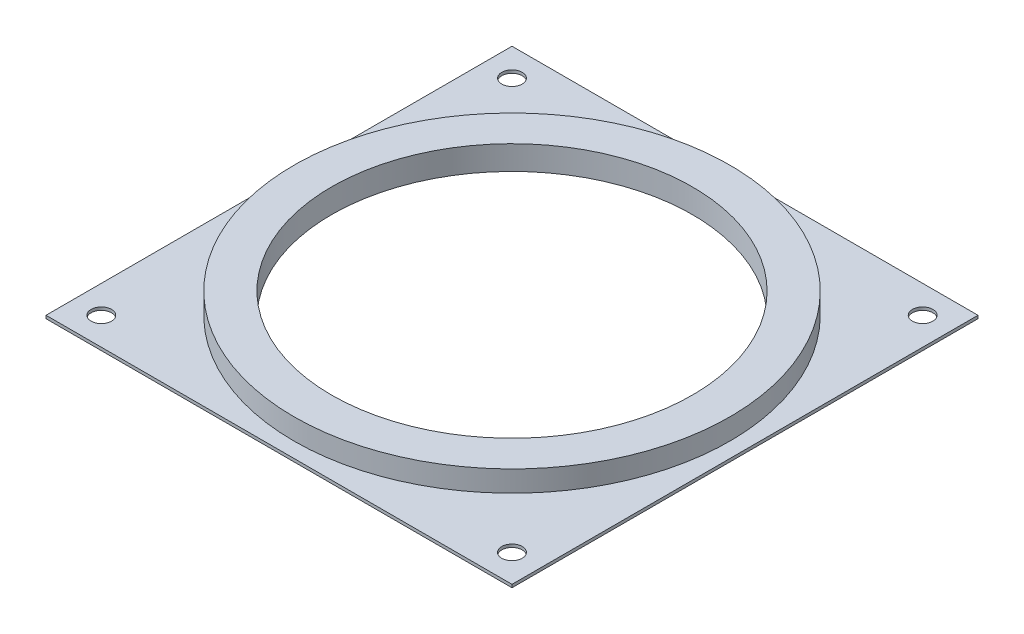
ISO-10303-21;
HEADER;
FILE_DESCRIPTION(('STEP AP214'),'2;1');
FILE_NAME('part.step','',(''),(''),'','','');
FILE_SCHEMA(('AUTOMOTIVE_DESIGN { 1 0 10303 214 1 1 1 1 }'));
ENDSEC;
DATA;
#1=APPLICATION_CONTEXT('core data for automotive mechanical design processes');
#2=APPLICATION_PROTOCOL_DEFINITION('international standard','automotive_design',2000,#1);
#3=PRODUCT_CONTEXT('',#1,'mechanical');
#4=PRODUCT('Part','Part','',(#3));
#5=PRODUCT_RELATED_PRODUCT_CATEGORY('part','',(#4));
#6=PRODUCT_DEFINITION_FORMATION('','',#4);
#7=PRODUCT_DEFINITION_CONTEXT('part definition',#1,'design');
#8=PRODUCT_DEFINITION('design','',#6,#7);
#9=PRODUCT_DEFINITION_SHAPE('','',#8);
#10=(LENGTH_UNIT() NAMED_UNIT(*) SI_UNIT(.MILLI.,.METRE.));
#11=(NAMED_UNIT(*) PLANE_ANGLE_UNIT() SI_UNIT($,.RADIAN.));
#12=(NAMED_UNIT(*) SI_UNIT($,.STERADIAN.) SOLID_ANGLE_UNIT());
#13=UNCERTAINTY_MEASURE_WITH_UNIT(LENGTH_MEASURE(1.E-05),#10,'distance_accuracy_value','');
#14=(GEOMETRIC_REPRESENTATION_CONTEXT(3) GLOBAL_UNCERTAINTY_ASSIGNED_CONTEXT((#13)) GLOBAL_UNIT_ASSIGNED_CONTEXT((#10,
#11,#12)) REPRESENTATION_CONTEXT('',''));
#15=CARTESIAN_POINT('',(0.,0.,0.));
#16=DIRECTION('',(0.,0.,1.));
#17=DIRECTION('',(1.,0.,0.));
#18=AXIS2_PLACEMENT_3D('',#15,#16,#17);
#19=CARTESIAN_POINT('',(0.,1.,0.));
#20=DIRECTION('',(0.,1.,0.));
#21=DIRECTION('',(0.,0.,1.));
#22=AXIS2_PLACEMENT_3D('',#19,#20,#21);
#23=PLANE('',#22);
#24=CARTESIAN_POINT('',(0.,1.,0.));
#25=DIRECTION('',(0.,1.,0.));
#26=DIRECTION('',(0.,0.,1.));
#27=AXIS2_PLACEMENT_3D('',#24,#25,#26);
#28=CIRCLE('',#27,72.5);
#29=CARTESIAN_POINT('',(0.,1.,72.5));
#30=VERTEX_POINT('',#29);
#31=EDGE_CURVE('E151',#30,#30,#28,.T.);
#32=ORIENTED_EDGE('',*,*,#31,.F.);
#33=EDGE_LOOP('',(#32));
#34=FACE_BOUND('',#33,.T.);
#35=CARTESIAN_POINT('',(-68.3,1.,68.2999999999999));
#36=DIRECTION('',(0.,1.,0.));
#37=DIRECTION('',(0.,0.,-1.));
#38=AXIS2_PLACEMENT_3D('',#35,#36,#37);
#39=CIRCLE('',#38,3.4);
#40=CARTESIAN_POINT('',(-68.3,1.,64.8999999999999));
#41=VERTEX_POINT('',#40);
#42=EDGE_CURVE('E136',#41,#41,#39,.T.);
#43=ORIENTED_EDGE('',*,*,#42,.F.);
#44=EDGE_LOOP('',(#43));
#45=FACE_BOUND('',#44,.T.);
#46=CARTESIAN_POINT('',(-68.3,1.,-68.3));
#47=DIRECTION('',(0.,1.,0.));
#48=DIRECTION('',(0.,0.,1.));
#49=AXIS2_PLACEMENT_3D('',#46,#47,#48);
#50=CIRCLE('',#49,3.4);
#51=CARTESIAN_POINT('',(-68.3,1.,-64.9));
#52=VERTEX_POINT('',#51);
#53=EDGE_CURVE('E126',#52,#52,#50,.T.);
#54=ORIENTED_EDGE('',*,*,#53,.F.);
#55=EDGE_LOOP('',(#54));
#56=FACE_BOUND('',#55,.T.);
#57=DIRECTION('',(0.,0.,-1.));
#58=VECTOR('',#57,1.);
#59=CARTESIAN_POINT('',(77.5,1.,-77.5));
#60=LINE('',#59,#58);
#61=CARTESIAN_POINT('',(77.5,1.,77.5));
#62=VERTEX_POINT('',#61);
#63=CARTESIAN_POINT('',(77.5,1.,-77.5));
#64=VERTEX_POINT('',#63);
#65=EDGE_CURVE('E97',#62,#64,#60,.T.);
#66=ORIENTED_EDGE('',*,*,#65,.T.);
#67=DIRECTION('',(-1.,0.,0.));
#68=VECTOR('',#67,1.);
#69=CARTESIAN_POINT('',(-77.5,1.,-77.5));
#70=LINE('',#69,#68);
#71=CARTESIAN_POINT('',(-77.5,1.,-77.5));
#72=VERTEX_POINT('',#71);
#73=EDGE_CURVE('E92',#64,#72,#70,.T.);
#74=ORIENTED_EDGE('',*,*,#73,.T.);
#75=DIRECTION('',(0.,0.,1.));
#76=VECTOR('',#75,1.);
#77=CARTESIAN_POINT('',(-77.5,1.,-77.5));
#78=LINE('',#77,#76);
#79=CARTESIAN_POINT('',(-77.5,1.,77.5));
#80=VERTEX_POINT('',#79);
#81=EDGE_CURVE('E95',#72,#80,#78,.T.);
#82=ORIENTED_EDGE('',*,*,#81,.T.);
#83=DIRECTION('',(1.,0.,0.));
#84=VECTOR('',#83,1.);
#85=CARTESIAN_POINT('',(-77.5,1.,77.5));
#86=LINE('',#85,#84);
#87=EDGE_CURVE('E62',#80,#62,#86,.T.);
#88=ORIENTED_EDGE('',*,*,#87,.T.);
#89=EDGE_LOOP('',(#66,#74,#82,#88));
#90=FACE_BOUND('',#89,.T.);
#91=CARTESIAN_POINT('',(68.2999999999999,1.,-68.3000000000001));
#92=DIRECTION('',(0.,1.,0.));
#93=DIRECTION('',(0.,0.,-1.));
#94=AXIS2_PLACEMENT_3D('',#91,#92,#93);
#95=CIRCLE('',#94,3.4);
#96=CARTESIAN_POINT('',(68.2999999999999,1.,-71.7000000000001));
#97=VERTEX_POINT('',#96);
#98=EDGE_CURVE('E130',#97,#97,#95,.T.);
#99=ORIENTED_EDGE('',*,*,#98,.F.);
#100=EDGE_LOOP('',(#99));
#101=FACE_BOUND('',#100,.T.);
#102=CARTESIAN_POINT('',(68.2999999999999,1.,68.3));
#103=DIRECTION('',(0.,1.,0.));
#104=DIRECTION('',(0.,0.,1.));
#105=AXIS2_PLACEMENT_3D('',#102,#103,#104);
#106=CIRCLE('',#105,3.4);
#107=CARTESIAN_POINT('',(68.2999999999999,1.,71.7));
#108=VERTEX_POINT('',#107);
#109=EDGE_CURVE('E142',#108,#108,#106,.T.);
#110=ORIENTED_EDGE('',*,*,#109,.F.);
#111=EDGE_LOOP('',(#110));
#112=FACE_BOUND('',#111,.T.);
#113=ADVANCED_FACE('F45',(#34,#45,#56,#90,#101,#112),#23,.T.);
#114=CARTESIAN_POINT('',(0.,0.,0.));
#115=DIRECTION('',(0.,1.,0.));
#116=DIRECTION('',(0.,0.,1.));
#117=AXIS2_PLACEMENT_3D('',#114,#115,#116);
#118=PLANE('',#117);
#119=DIRECTION('',(0.,0.,-1.));
#120=VECTOR('',#119,1.);
#121=CARTESIAN_POINT('',(77.5,0.,-77.5));
#122=LINE('',#121,#120);
#123=CARTESIAN_POINT('',(77.5,0.,77.5));
#124=VERTEX_POINT('',#123);
#125=CARTESIAN_POINT('',(77.5,0.,-77.5));
#126=VERTEX_POINT('',#125);
#127=EDGE_CURVE('E109',#124,#126,#122,.T.);
#128=ORIENTED_EDGE('',*,*,#127,.F.);
#129=DIRECTION('',(1.,0.,0.));
#130=VECTOR('',#129,1.);
#131=CARTESIAN_POINT('',(-77.5,0.,77.5));
#132=LINE('',#131,#130);
#133=CARTESIAN_POINT('',(-77.5,0.,77.5));
#134=VERTEX_POINT('',#133);
#135=EDGE_CURVE('E85',#134,#124,#132,.T.);
#136=ORIENTED_EDGE('',*,*,#135,.F.);
#137=DIRECTION('',(0.,0.,1.));
#138=VECTOR('',#137,1.);
#139=CARTESIAN_POINT('',(-77.5,0.,-77.5));
#140=LINE('',#139,#138);
#141=CARTESIAN_POINT('',(-77.5,0.,-77.5));
#142=VERTEX_POINT('',#141);
#143=EDGE_CURVE('E79',#142,#134,#140,.T.);
#144=ORIENTED_EDGE('',*,*,#143,.F.);
#145=DIRECTION('',(-1.,0.,0.));
#146=VECTOR('',#145,1.);
#147=CARTESIAN_POINT('',(-77.5,0.,-77.5));
#148=LINE('',#147,#146);
#149=EDGE_CURVE('E101',#126,#142,#148,.T.);
#150=ORIENTED_EDGE('',*,*,#149,.F.);
#151=EDGE_LOOP('',(#128,#136,#144,#150));
#152=FACE_BOUND('',#151,.T.);
#153=CARTESIAN_POINT('',(0.,0.,0.));
#154=DIRECTION('',(0.,1.,0.));
#155=DIRECTION('',(0.,0.,1.));
#156=AXIS2_PLACEMENT_3D('',#153,#154,#155);
#157=CIRCLE('',#156,60.);
#158=CARTESIAN_POINT('',(0.,0.,60.));
#159=VERTEX_POINT('',#158);
#160=EDGE_CURVE('E112',#159,#159,#157,.T.);
#161=ORIENTED_EDGE('',*,*,#160,.T.);
#162=EDGE_LOOP('',(#161));
#163=FACE_BOUND('',#162,.T.);
#164=CARTESIAN_POINT('',(-68.3,0.,-68.3));
#165=DIRECTION('',(0.,1.,0.));
#166=DIRECTION('',(0.,0.,1.));
#167=AXIS2_PLACEMENT_3D('',#164,#165,#166);
#168=CIRCLE('',#167,3.4);
#169=CARTESIAN_POINT('',(-68.3,0.,-64.9));
#170=VERTEX_POINT('',#169);
#171=EDGE_CURVE('E127',#170,#170,#168,.T.);
#172=ORIENTED_EDGE('',*,*,#171,.T.);
#173=EDGE_LOOP('',(#172));
#174=FACE_BOUND('',#173,.T.);
#175=CARTESIAN_POINT('',(68.2999999999999,0.,-68.3000000000001));
#176=DIRECTION('',(0.,1.,0.));
#177=DIRECTION('',(0.,0.,-1.));
#178=AXIS2_PLACEMENT_3D('',#175,#176,#177);
#179=CIRCLE('',#178,3.4);
#180=CARTESIAN_POINT('',(68.2999999999999,0.,-71.7000000000001));
#181=VERTEX_POINT('',#180);
#182=EDGE_CURVE('E133',#181,#181,#179,.T.);
#183=ORIENTED_EDGE('',*,*,#182,.T.);
#184=EDGE_LOOP('',(#183));
#185=FACE_BOUND('',#184,.T.);
#186=CARTESIAN_POINT('',(-68.3,0.,68.2999999999999));
#187=DIRECTION('',(0.,1.,0.));
#188=DIRECTION('',(0.,0.,-1.));
#189=AXIS2_PLACEMENT_3D('',#186,#187,#188);
#190=CIRCLE('',#189,3.4);
#191=CARTESIAN_POINT('',(-68.3,0.,64.8999999999999));
#192=VERTEX_POINT('',#191);
#193=EDGE_CURVE('E139',#192,#192,#190,.T.);
#194=ORIENTED_EDGE('',*,*,#193,.T.);
#195=EDGE_LOOP('',(#194));
#196=FACE_BOUND('',#195,.T.);
#197=CARTESIAN_POINT('',(68.2999999999999,0.,68.3));
#198=DIRECTION('',(0.,1.,0.));
#199=DIRECTION('',(0.,0.,1.));
#200=AXIS2_PLACEMENT_3D('',#197,#198,#199);
#201=CIRCLE('',#200,3.4);
#202=CARTESIAN_POINT('',(68.2999999999999,0.,71.7));
#203=VERTEX_POINT('',#202);
#204=EDGE_CURVE('E145',#203,#203,#201,.T.);
#205=ORIENTED_EDGE('',*,*,#204,.T.);
#206=EDGE_LOOP('',(#205));
#207=FACE_BOUND('',#206,.T.);
#208=ADVANCED_FACE('F120',(#152,#163,#174,#185,#196,#207),#118,.F.);
#209=CARTESIAN_POINT('',(77.5,1.,-77.5));
#210=DIRECTION('',(-1.,0.,0.));
#211=DIRECTION('',(0.,0.,1.));
#212=AXIS2_PLACEMENT_3D('',#209,#210,#211);
#213=PLANE('',#212);
#214=ORIENTED_EDGE('',*,*,#127,.T.);
#215=DIRECTION('',(0.,-1.,0.));
#216=VECTOR('',#215,1.);
#217=CARTESIAN_POINT('',(77.5,1.,-77.5));
#218=LINE('',#217,#216);
#219=EDGE_CURVE('E11',#64,#126,#218,.T.);
#220=ORIENTED_EDGE('',*,*,#219,.F.);
#221=ORIENTED_EDGE('',*,*,#65,.F.);
#222=DIRECTION('',(0.,-1.,0.));
#223=VECTOR('',#222,1.);
#224=CARTESIAN_POINT('',(77.5,1.,77.5));
#225=LINE('',#224,#223);
#226=EDGE_CURVE('E105',#62,#124,#225,.T.);
#227=ORIENTED_EDGE('',*,*,#226,.T.);
#228=EDGE_LOOP('',(#214,#220,#221,#227));
#229=FACE_BOUND('',#228,.T.);
#230=ADVANCED_FACE('F47',(#229),#213,.F.);
#231=CARTESIAN_POINT('',(-77.5,1.,-77.5));
#232=DIRECTION('',(0.,0.,1.));
#233=DIRECTION('',(1.,0.,0.));
#234=AXIS2_PLACEMENT_3D('',#231,#232,#233);
#235=PLANE('',#234);
#236=ORIENTED_EDGE('',*,*,#149,.T.);
#237=DIRECTION('',(0.,-1.,0.));
#238=VECTOR('',#237,1.);
#239=CARTESIAN_POINT('',(-77.5,1.,-77.5));
#240=LINE('',#239,#238);
#241=EDGE_CURVE('E54',#72,#142,#240,.T.);
#242=ORIENTED_EDGE('',*,*,#241,.F.);
#243=ORIENTED_EDGE('',*,*,#73,.F.);
#244=ORIENTED_EDGE('',*,*,#219,.T.);
#245=EDGE_LOOP('',(#236,#242,#243,#244));
#246=FACE_BOUND('',#245,.T.);
#247=ADVANCED_FACE('F100',(#246),#235,.F.);
#248=CARTESIAN_POINT('',(-77.5,1.,-77.5));
#249=DIRECTION('',(1.,0.,0.));
#250=DIRECTION('',(0.,0.,-1.));
#251=AXIS2_PLACEMENT_3D('',#248,#249,#250);
#252=PLANE('',#251);
#253=ORIENTED_EDGE('',*,*,#143,.T.);
#254=DIRECTION('',(0.,-1.,0.));
#255=VECTOR('',#254,1.);
#256=CARTESIAN_POINT('',(-77.5,1.,77.5));
#257=LINE('',#256,#255);
#258=EDGE_CURVE('E102',#80,#134,#257,.T.);
#259=ORIENTED_EDGE('',*,*,#258,.F.);
#260=ORIENTED_EDGE('',*,*,#81,.F.);
#261=ORIENTED_EDGE('',*,*,#241,.T.);
#262=EDGE_LOOP('',(#253,#259,#260,#261));
#263=FACE_BOUND('',#262,.T.);
#264=ADVANCED_FACE('F103',(#263),#252,.F.);
#265=CARTESIAN_POINT('',(-77.5,1.,77.5));
#266=DIRECTION('',(0.,0.,-1.));
#267=DIRECTION('',(-1.,0.,0.));
#268=AXIS2_PLACEMENT_3D('',#265,#266,#267);
#269=PLANE('',#268);
#270=ORIENTED_EDGE('',*,*,#135,.T.);
#271=ORIENTED_EDGE('',*,*,#226,.F.);
#272=ORIENTED_EDGE('',*,*,#87,.F.);
#273=ORIENTED_EDGE('',*,*,#258,.T.);
#274=EDGE_LOOP('',(#270,#271,#272,#273));
#275=FACE_BOUND('',#274,.T.);
#276=ADVANCED_FACE('F117',(#275),#269,.F.);
#277=CARTESIAN_POINT('',(0.,1.,0.));
#278=DIRECTION('',(0.,-1.,0.));
#279=DIRECTION('',(0.,0.,-1.));
#280=AXIS2_PLACEMENT_3D('',#277,#278,#279);
#281=CYLINDRICAL_SURFACE('',#280,60.);
#282=ORIENTED_EDGE('',*,*,#160,.F.);
#283=EDGE_LOOP('',(#282));
#284=FACE_BOUND('',#283,.T.);
#285=CARTESIAN_POINT('',(0.,8.,0.));
#286=DIRECTION('',(0.,1.,0.));
#287=DIRECTION('',(0.,0.,1.));
#288=AXIS2_PLACEMENT_3D('',#285,#286,#287);
#289=CIRCLE('',#288,60.);
#290=CARTESIAN_POINT('',(0.,8.,60.));
#291=VERTEX_POINT('',#290);
#292=EDGE_CURVE('E154',#291,#291,#289,.F.);
#293=ORIENTED_EDGE('',*,*,#292,.F.);
#294=EDGE_LOOP('',(#293));
#295=FACE_BOUND('',#294,.T.);
#296=ADVANCED_FACE('F163',(#284,#295),#281,.F.);
#297=CARTESIAN_POINT('',(-68.3,1.,-68.3));
#298=DIRECTION('',(0.,-1.,0.));
#299=DIRECTION('',(0.,0.,-1.));
#300=AXIS2_PLACEMENT_3D('',#297,#298,#299);
#301=CYLINDRICAL_SURFACE('',#300,3.4);
#302=ORIENTED_EDGE('',*,*,#53,.T.);
#303=EDGE_LOOP('',(#302));
#304=FACE_BOUND('',#303,.T.);
#305=ORIENTED_EDGE('',*,*,#171,.F.);
#306=EDGE_LOOP('',(#305));
#307=FACE_BOUND('',#306,.T.);
#308=ADVANCED_FACE('F165',(#304,#307),#301,.F.);
#309=CARTESIAN_POINT('',(68.2999999999999,1.,-68.3000000000001));
#310=DIRECTION('',(0.,-1.,0.));
#311=DIRECTION('',(0.,0.,-1.));
#312=AXIS2_PLACEMENT_3D('',#309,#310,#311);
#313=CYLINDRICAL_SURFACE('',#312,3.4);
#314=ORIENTED_EDGE('',*,*,#98,.T.);
#315=EDGE_LOOP('',(#314));
#316=FACE_BOUND('',#315,.T.);
#317=ORIENTED_EDGE('',*,*,#182,.F.);
#318=EDGE_LOOP('',(#317));
#319=FACE_BOUND('',#318,.T.);
#320=ADVANCED_FACE('F173',(#316,#319),#313,.F.);
#321=CARTESIAN_POINT('',(-68.3,1.,68.2999999999999));
#322=DIRECTION('',(0.,-1.,0.));
#323=DIRECTION('',(0.,0.,-1.));
#324=AXIS2_PLACEMENT_3D('',#321,#322,#323);
#325=CYLINDRICAL_SURFACE('',#324,3.4);
#326=ORIENTED_EDGE('',*,*,#42,.T.);
#327=EDGE_LOOP('',(#326));
#328=FACE_BOUND('',#327,.T.);
#329=ORIENTED_EDGE('',*,*,#193,.F.);
#330=EDGE_LOOP('',(#329));
#331=FACE_BOUND('',#330,.T.);
#332=ADVANCED_FACE('F240',(#328,#331),#325,.F.);
#333=CARTESIAN_POINT('',(68.2999999999999,1.,68.3));
#334=DIRECTION('',(0.,-1.,0.));
#335=DIRECTION('',(0.,0.,-1.));
#336=AXIS2_PLACEMENT_3D('',#333,#334,#335);
#337=CYLINDRICAL_SURFACE('',#336,3.4);
#338=ORIENTED_EDGE('',*,*,#109,.T.);
#339=EDGE_LOOP('',(#338));
#340=FACE_BOUND('',#339,.T.);
#341=ORIENTED_EDGE('',*,*,#204,.F.);
#342=EDGE_LOOP('',(#341));
#343=FACE_BOUND('',#342,.T.);
#344=ADVANCED_FACE('F249',(#340,#343),#337,.F.);
#345=CARTESIAN_POINT('',(0.,8.,0.));
#346=DIRECTION('',(0.,-1.,0.));
#347=DIRECTION('',(0.,0.,-1.));
#348=AXIS2_PLACEMENT_3D('',#345,#346,#347);
#349=CYLINDRICAL_SURFACE('',#348,72.5);
#350=CARTESIAN_POINT('',(0.,8.,0.));
#351=DIRECTION('',(0.,1.,0.));
#352=DIRECTION('',(0.,0.,1.));
#353=AXIS2_PLACEMENT_3D('',#350,#351,#352);
#354=CIRCLE('',#353,72.5);
#355=CARTESIAN_POINT('',(0.,8.,72.5));
#356=VERTEX_POINT('',#355);
#357=EDGE_CURVE('E148',#356,#356,#354,.T.);
#358=ORIENTED_EDGE('',*,*,#357,.F.);
#359=EDGE_LOOP('',(#358));
#360=FACE_BOUND('',#359,.T.);
#361=ORIENTED_EDGE('',*,*,#31,.T.);
#362=EDGE_LOOP('',(#361));
#363=FACE_BOUND('',#362,.T.);
#364=ADVANCED_FACE('F257',(#360,#363),#349,.T.);
#365=CARTESIAN_POINT('',(0.,8.,0.));
#366=DIRECTION('',(0.,1.,0.));
#367=DIRECTION('',(0.,0.,1.));
#368=AXIS2_PLACEMENT_3D('',#365,#366,#367);
#369=PLANE('',#368);
#370=ORIENTED_EDGE('',*,*,#292,.T.);
#371=EDGE_LOOP('',(#370));
#372=FACE_BOUND('',#371,.T.);
#373=ORIENTED_EDGE('',*,*,#357,.T.);
#374=EDGE_LOOP('',(#373));
#375=FACE_BOUND('',#374,.T.);
#376=ADVANCED_FACE('F160',(#372,#375),#369,.T.);
#377=CLOSED_SHELL('',(#113,#208,#230,#247,#264,#276,#296,#308,#320,#332,#344,#364,#376));
#378=MANIFOLD_SOLID_BREP('B2',#377);
#379=ADVANCED_BREP_SHAPE_REPRESENTATION('',(#18,#378),#14);
#380=SHAPE_DEFINITION_REPRESENTATION(#9,#379);
ENDSEC;
END-ISO-10303-21;
